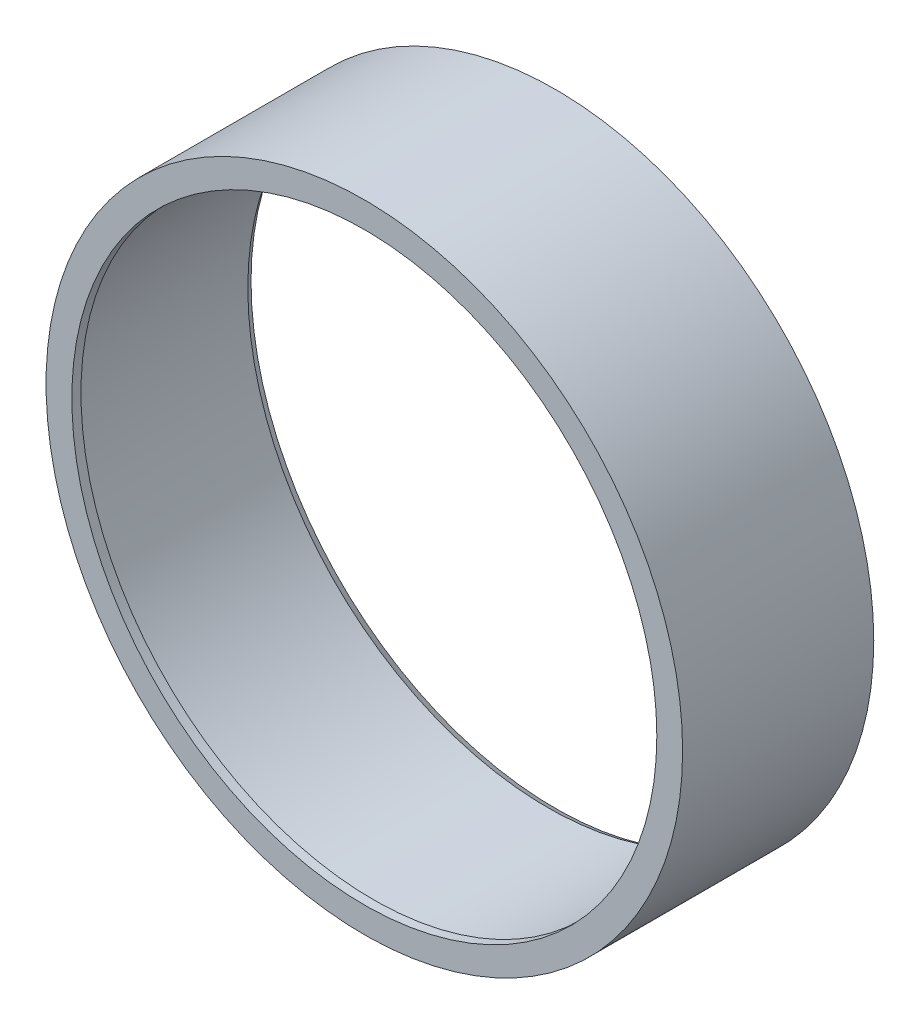
ISO-10303-21;
HEADER;
FILE_DESCRIPTION(('STEP AP214'),'2;1');
FILE_NAME('part.step','',(''),(''),'','','');
FILE_SCHEMA(('AUTOMOTIVE_DESIGN { 1 0 10303 214 1 1 1 1 }'));
ENDSEC;
DATA;
#1=APPLICATION_CONTEXT('core data for automotive mechanical design processes');
#2=APPLICATION_PROTOCOL_DEFINITION('international standard','automotive_design',2000,#1);
#3=PRODUCT_CONTEXT('',#1,'mechanical');
#4=PRODUCT('Part','Part','',(#3));
#5=PRODUCT_RELATED_PRODUCT_CATEGORY('part','',(#4));
#6=PRODUCT_DEFINITION_FORMATION('','',#4);
#7=PRODUCT_DEFINITION_CONTEXT('part definition',#1,'design');
#8=PRODUCT_DEFINITION('design','',#6,#7);
#9=PRODUCT_DEFINITION_SHAPE('','',#8);
#10=(LENGTH_UNIT() NAMED_UNIT(*) SI_UNIT(.MILLI.,.METRE.));
#11=(NAMED_UNIT(*) PLANE_ANGLE_UNIT() SI_UNIT($,.RADIAN.));
#12=(NAMED_UNIT(*) SI_UNIT($,.STERADIAN.) SOLID_ANGLE_UNIT());
#13=UNCERTAINTY_MEASURE_WITH_UNIT(LENGTH_MEASURE(1.E-05),#10,'distance_accuracy_value','');
#14=(GEOMETRIC_REPRESENTATION_CONTEXT(3) GLOBAL_UNCERTAINTY_ASSIGNED_CONTEXT((#13)) GLOBAL_UNIT_ASSIGNED_CONTEXT((#10,
#11,#12)) REPRESENTATION_CONTEXT('',''));
#15=CARTESIAN_POINT('',(0.,0.,0.));
#16=DIRECTION('',(0.,0.,1.));
#17=DIRECTION('',(1.,0.,0.));
#18=AXIS2_PLACEMENT_3D('',#15,#16,#17);
#19=CARTESIAN_POINT('',(0.,0.,0.));
#20=DIRECTION('',(0.,0.,1.));
#21=DIRECTION('',(1.,0.,0.));
#22=AXIS2_PLACEMENT_3D('',#19,#20,#21);
#23=CYLINDRICAL_SURFACE('',#22,19.78);
#24=CARTESIAN_POINT('',(0.,0.,-12.1));
#25=DIRECTION('',(0.,0.,-1.));
#26=DIRECTION('',(-1.,0.,0.));
#27=AXIS2_PLACEMENT_3D('',#24,#25,#26);
#28=CIRCLE('',#27,19.78);
#29=CARTESIAN_POINT('',(-19.78,0.,-12.1));
#30=VERTEX_POINT('',#29);
#31=EDGE_CURVE('E30',#30,#30,#28,.T.);
#32=ORIENTED_EDGE('',*,*,#31,.T.);
#33=EDGE_LOOP('',(#32));
#34=FACE_BOUND('',#33,.T.);
#35=CARTESIAN_POINT('',(0.,0.,-0.6));
#36=DIRECTION('',(0.,0.,1.));
#37=DIRECTION('',(1.,0.,0.));
#38=AXIS2_PLACEMENT_3D('',#35,#36,#37);
#39=CIRCLE('',#38,19.78);
#40=CARTESIAN_POINT('',(19.78,0.,-0.6));
#41=VERTEX_POINT('',#40);
#42=EDGE_CURVE('E18',#41,#41,#39,.F.);
#43=ORIENTED_EDGE('',*,*,#42,.F.);
#44=EDGE_LOOP('',(#43));
#45=FACE_BOUND('',#44,.T.);
#46=ADVANCED_FACE('F15',(#34,#45),#23,.F.);
#47=CARTESIAN_POINT('',(19.78,0.,-0.6));
#48=DIRECTION('',(0.,0.,-1.));
#49=DIRECTION('',(-1.,0.,0.));
#50=AXIS2_PLACEMENT_3D('',#47,#48,#49);
#51=PLANE('',#50);
#52=ORIENTED_EDGE('',*,*,#42,.T.);
#53=EDGE_LOOP('',(#52));
#54=FACE_BOUND('',#53,.T.);
#55=CARTESIAN_POINT('',(0.,0.,-0.6));
#56=DIRECTION('',(0.,0.,1.));
#57=DIRECTION('',(1.,0.,0.));
#58=AXIS2_PLACEMENT_3D('',#55,#56,#57);
#59=CIRCLE('',#58,19.28);
#60=CARTESIAN_POINT('',(19.28,0.,-0.6));
#61=VERTEX_POINT('',#60);
#62=EDGE_CURVE('E36',#61,#61,#59,.T.);
#63=ORIENTED_EDGE('',*,*,#62,.T.);
#64=EDGE_LOOP('',(#63));
#65=FACE_BOUND('',#64,.T.);
#66=ADVANCED_FACE('F46',(#54,#65),#51,.T.);
#67=CARTESIAN_POINT('',(0.,0.,-12.6));
#68=DIRECTION('',(0.,0.,-1.));
#69=DIRECTION('',(-1.,0.,0.));
#70=AXIS2_PLACEMENT_3D('',#67,#68,#69);
#71=CONICAL_SURFACE('',#70,20.0686751345948,0.523598775598295);
#72=ORIENTED_EDGE('',*,*,#31,.F.);
#73=EDGE_LOOP('',(#72));
#74=FACE_BOUND('',#73,.T.);
#75=CARTESIAN_POINT('',(0.,0.,-12.6));
#76=DIRECTION('',(0.,0.,-1.));
#77=DIRECTION('',(-1.,0.,0.));
#78=AXIS2_PLACEMENT_3D('',#75,#76,#77);
#79=CIRCLE('',#78,20.0686751345948);
#80=CARTESIAN_POINT('',(-20.0686751345948,0.,-12.6));
#81=VERTEX_POINT('',#80);
#82=EDGE_CURVE('E34',#81,#81,#79,.F.);
#83=ORIENTED_EDGE('',*,*,#82,.F.);
#84=EDGE_LOOP('',(#83));
#85=FACE_BOUND('',#84,.T.);
#86=ADVANCED_FACE('F53',(#74,#85),#71,.F.);
#87=CARTESIAN_POINT('',(0.,0.,0.));
#88=DIRECTION('',(0.,0.,1.));
#89=DIRECTION('',(1.,0.,0.));
#90=AXIS2_PLACEMENT_3D('',#87,#88,#89);
#91=CYLINDRICAL_SURFACE('',#90,19.28);
#92=CARTESIAN_POINT('',(0.,0.,0.));
#93=DIRECTION('',(0.,0.,1.));
#94=DIRECTION('',(1.,0.,0.));
#95=AXIS2_PLACEMENT_3D('',#92,#93,#94);
#96=CIRCLE('',#95,19.28);
#97=CARTESIAN_POINT('',(19.28,0.,0.));
#98=VERTEX_POINT('',#97);
#99=EDGE_CURVE('E27',#98,#98,#96,.F.);
#100=ORIENTED_EDGE('',*,*,#99,.F.);
#101=EDGE_LOOP('',(#100));
#102=FACE_BOUND('',#101,.T.);
#103=ORIENTED_EDGE('',*,*,#62,.F.);
#104=EDGE_LOOP('',(#103));
#105=FACE_BOUND('',#104,.T.);
#106=ADVANCED_FACE('F68',(#102,#105),#91,.F.);
#107=CARTESIAN_POINT('',(20.98,0.,-12.6));
#108=DIRECTION('',(0.,0.,-1.));
#109=DIRECTION('',(-1.,0.,0.));
#110=AXIS2_PLACEMENT_3D('',#107,#108,#109);
#111=PLANE('',#110);
#112=CARTESIAN_POINT('',(0.,0.,-12.6));
#113=DIRECTION('',(0.,0.,1.));
#114=DIRECTION('',(1.,0.,0.));
#115=AXIS2_PLACEMENT_3D('',#112,#113,#114);
#116=CIRCLE('',#115,20.98);
#117=CARTESIAN_POINT('',(20.98,0.,-12.6));
#118=VERTEX_POINT('',#117);
#119=EDGE_CURVE('E22',#118,#118,#116,.T.);
#120=ORIENTED_EDGE('',*,*,#119,.F.);
#121=EDGE_LOOP('',(#120));
#122=FACE_BOUND('',#121,.T.);
#123=ORIENTED_EDGE('',*,*,#82,.T.);
#124=EDGE_LOOP('',(#123));
#125=FACE_BOUND('',#124,.T.);
#126=ADVANCED_FACE('F61',(#122,#125),#111,.T.);
#127=CARTESIAN_POINT('',(19.28,0.,0.));
#128=DIRECTION('',(0.,0.,1.));
#129=DIRECTION('',(1.,0.,0.));
#130=AXIS2_PLACEMENT_3D('',#127,#128,#129);
#131=PLANE('',#130);
#132=ORIENTED_EDGE('',*,*,#99,.T.);
#133=EDGE_LOOP('',(#132));
#134=FACE_BOUND('',#133,.T.);
#135=CARTESIAN_POINT('',(0.,0.,0.));
#136=DIRECTION('',(0.,0.,1.));
#137=DIRECTION('',(1.,0.,0.));
#138=AXIS2_PLACEMENT_3D('',#135,#136,#137);
#139=CIRCLE('',#138,20.98);
#140=CARTESIAN_POINT('',(20.98,0.,0.));
#141=VERTEX_POINT('',#140);
#142=EDGE_CURVE('E10',#141,#141,#139,.F.);
#143=ORIENTED_EDGE('',*,*,#142,.F.);
#144=EDGE_LOOP('',(#143));
#145=FACE_BOUND('',#144,.T.);
#146=ADVANCED_FACE('F56',(#134,#145),#131,.T.);
#147=CARTESIAN_POINT('',(0.,0.,0.));
#148=DIRECTION('',(0.,0.,1.));
#149=DIRECTION('',(1.,0.,0.));
#150=AXIS2_PLACEMENT_3D('',#147,#148,#149);
#151=CYLINDRICAL_SURFACE('',#150,20.98);
#152=ORIENTED_EDGE('',*,*,#142,.T.);
#153=EDGE_LOOP('',(#152));
#154=FACE_BOUND('',#153,.T.);
#155=ORIENTED_EDGE('',*,*,#119,.T.);
#156=EDGE_LOOP('',(#155));
#157=FACE_BOUND('',#156,.T.);
#158=ADVANCED_FACE('F54',(#154,#157),#151,.T.);
#159=CLOSED_SHELL('',(#46,#66,#86,#106,#126,#146,#158));
#160=MANIFOLD_SOLID_BREP('B1',#159);
#161=ADVANCED_BREP_SHAPE_REPRESENTATION('',(#18,#160),#14);
#162=SHAPE_DEFINITION_REPRESENTATION(#9,#161);
ENDSEC;
END-ISO-10303-21;
